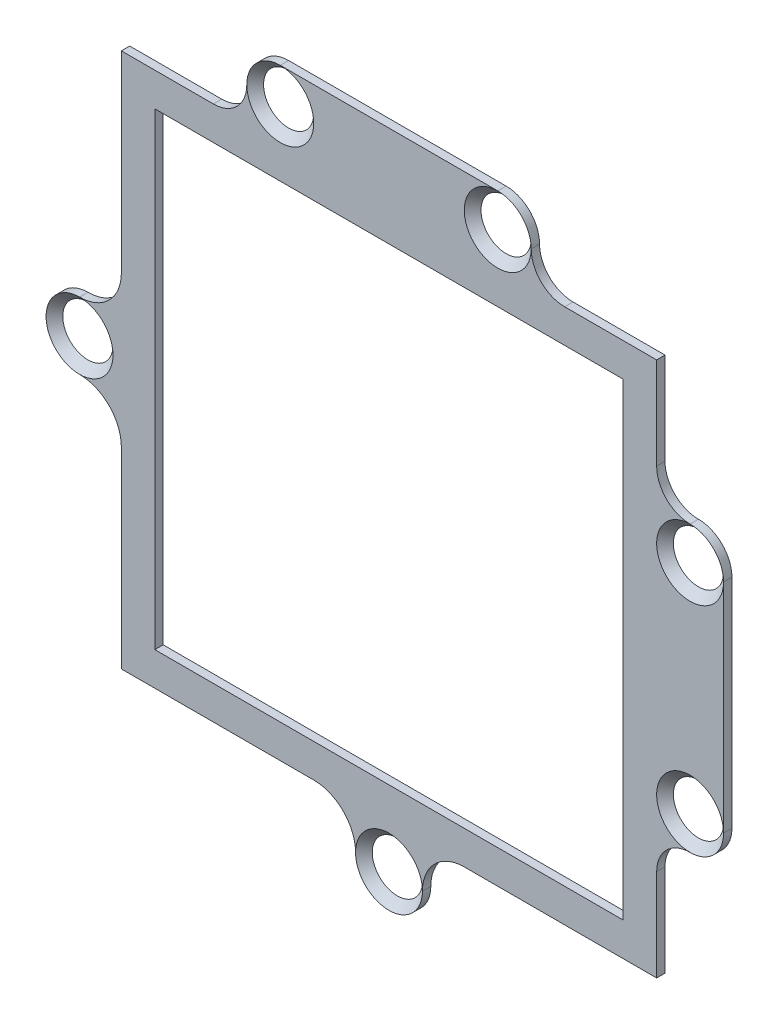
ISO-10303-21;
HEADER;
FILE_DESCRIPTION(('STEP AP214'),'2;1');
FILE_NAME('part.step','',(''),(''),'','','');
FILE_SCHEMA(('AUTOMOTIVE_DESIGN { 1 0 10303 214 1 1 1 1 }'));
ENDSEC;
DATA;
#1=APPLICATION_CONTEXT('core data for automotive mechanical design processes');
#2=APPLICATION_PROTOCOL_DEFINITION('international standard','automotive_design',2000,#1);
#3=PRODUCT_CONTEXT('',#1,'mechanical');
#4=PRODUCT('Part','Part','',(#3));
#5=PRODUCT_RELATED_PRODUCT_CATEGORY('part','',(#4));
#6=PRODUCT_DEFINITION_FORMATION('','',#4);
#7=PRODUCT_DEFINITION_CONTEXT('part definition',#1,'design');
#8=PRODUCT_DEFINITION('design','',#6,#7);
#9=PRODUCT_DEFINITION_SHAPE('','',#8);
#10=(LENGTH_UNIT() NAMED_UNIT(*) SI_UNIT(.MILLI.,.METRE.));
#11=(NAMED_UNIT(*) PLANE_ANGLE_UNIT() SI_UNIT($,.RADIAN.));
#12=(NAMED_UNIT(*) SI_UNIT($,.STERADIAN.) SOLID_ANGLE_UNIT());
#13=UNCERTAINTY_MEASURE_WITH_UNIT(LENGTH_MEASURE(1.E-05),#10,'distance_accuracy_value','');
#14=(GEOMETRIC_REPRESENTATION_CONTEXT(3) GLOBAL_UNCERTAINTY_ASSIGNED_CONTEXT((#13)) GLOBAL_UNIT_ASSIGNED_CONTEXT((#10,
#11,#12)) REPRESENTATION_CONTEXT('',''));
#15=CARTESIAN_POINT('',(0.,0.,0.));
#16=DIRECTION('',(0.,0.,1.));
#17=DIRECTION('',(1.,0.,0.));
#18=AXIS2_PLACEMENT_3D('',#15,#16,#17);
#19=CARTESIAN_POINT('',(36.0000000000001,-21.0000000000002,1.));
#20=DIRECTION('',(0.,0.,1.));
#21=DIRECTION('',(1.,0.,0.));
#22=AXIS2_PLACEMENT_3D('',#19,#20,#21);
#23=PLANE('',#22);
#24=CARTESIAN_POINT('',(21.0000000000002,36.0000000000001,1.));
#25=DIRECTION('',(0.,0.,-1.));
#26=DIRECTION('',(1.,0.,0.));
#27=AXIS2_PLACEMENT_3D('',#24,#25,#26);
#28=CIRCLE('',#27,4.00000000000011);
#29=CARTESIAN_POINT('',(21.0000000000002,32.,1.));
#30=VERTEX_POINT('',#29);
#31=CARTESIAN_POINT('',(17.0000000000001,36.0000000000001,1.));
#32=VERTEX_POINT('',#31);
#33=EDGE_CURVE('E300',#30,#32,#28,.T.);
#34=ORIENTED_EDGE('',*,*,#33,.T.);
#35=CARTESIAN_POINT('',(13.0000000000001,36.0000000000001,1.));
#36=DIRECTION('',(0.,0.,1.));
#37=DIRECTION('',(1.,0.,0.));
#38=AXIS2_PLACEMENT_3D('',#35,#36,#37);
#39=CIRCLE('',#38,4.00000000000001);
#40=CARTESIAN_POINT('',(13.0000000000001,40.0000000000001,1.));
#41=VERTEX_POINT('',#40);
#42=EDGE_CURVE('E11',#32,#41,#39,.F.);
#43=ORIENTED_EDGE('',*,*,#42,.T.);
#44=DIRECTION('',(-1.,0.,0.));
#45=VECTOR('',#44,1.);
#46=CARTESIAN_POINT('',(13.0000000000001,40.0000000000001,1.));
#47=LINE('',#46,#45);
#48=CARTESIAN_POINT('',(-13.0000000000001,40.0000000000001,1.));
#49=VERTEX_POINT('',#48);
#50=EDGE_CURVE('E306',#41,#49,#47,.T.);
#51=ORIENTED_EDGE('',*,*,#50,.T.);
#52=CARTESIAN_POINT('',(-13.0000000000001,36.0000000000001,1.));
#53=DIRECTION('',(0.,0.,1.));
#54=DIRECTION('',(1.,0.,0.));
#55=AXIS2_PLACEMENT_3D('',#52,#53,#54);
#56=CIRCLE('',#55,4.00000000000001);
#57=CARTESIAN_POINT('',(-17.0000000000001,36.0000000000001,1.));
#58=VERTEX_POINT('',#57);
#59=EDGE_CURVE('E51',#49,#58,#56,.F.);
#60=ORIENTED_EDGE('',*,*,#59,.T.);
#61=CARTESIAN_POINT('',(-21.0000000000003,36.0000000000001,1.));
#62=DIRECTION('',(0.,0.,-1.));
#63=DIRECTION('',(1.,0.,0.));
#64=AXIS2_PLACEMENT_3D('',#61,#62,#63);
#65=CIRCLE('',#64,4.00000000000012);
#66=CARTESIAN_POINT('',(-21.0000000000003,32.,1.));
#67=VERTEX_POINT('',#66);
#68=EDGE_CURVE('E314',#58,#67,#65,.T.);
#69=ORIENTED_EDGE('',*,*,#68,.T.);
#70=DIRECTION('',(-1.,0.,0.));
#71=VECTOR('',#70,1.);
#72=CARTESIAN_POINT('',(-21.0000000000003,32.,1.));
#73=LINE('',#72,#71);
#74=CARTESIAN_POINT('',(-32.,32.,1.));
#75=VERTEX_POINT('',#74);
#76=EDGE_CURVE('E317',#67,#75,#73,.T.);
#77=ORIENTED_EDGE('',*,*,#76,.T.);
#78=DIRECTION('',(0.,-1.,0.));
#79=VECTOR('',#78,1.);
#80=CARTESIAN_POINT('',(-32.,32.,1.));
#81=LINE('',#80,#79);
#82=CARTESIAN_POINT('',(-32.,9.00000000000001,1.));
#83=VERTEX_POINT('',#82);
#84=EDGE_CURVE('E320',#75,#83,#81,.T.);
#85=ORIENTED_EDGE('',*,*,#84,.T.);
#86=CARTESIAN_POINT('',(-37.,9.00000000000001,1.));
#87=DIRECTION('',(0.,0.,-1.));
#88=DIRECTION('',(1.,0.,0.));
#89=AXIS2_PLACEMENT_3D('',#86,#87,#88);
#90=CIRCLE('',#89,5.);
#91=CARTESIAN_POINT('',(-37.,4.,1.));
#92=VERTEX_POINT('',#91);
#93=EDGE_CURVE('E323',#83,#92,#90,.T.);
#94=ORIENTED_EDGE('',*,*,#93,.T.);
#95=CARTESIAN_POINT('',(-37.,0.,1.));
#96=DIRECTION('',(0.,0.,1.));
#97=DIRECTION('',(1.,0.,0.));
#98=AXIS2_PLACEMENT_3D('',#95,#96,#97);
#99=CIRCLE('',#98,4.00000000000002);
#100=CARTESIAN_POINT('',(-37.,-4.,1.));
#101=VERTEX_POINT('',#100);
#102=EDGE_CURVE('E558',#92,#101,#99,.F.);
#103=ORIENTED_EDGE('',*,*,#102,.T.);
#104=CARTESIAN_POINT('',(-37.,-9.00000000000001,1.));
#105=DIRECTION('',(0.,0.,-1.));
#106=DIRECTION('',(1.,0.,0.));
#107=AXIS2_PLACEMENT_3D('',#104,#105,#106);
#108=CIRCLE('',#107,5.);
#109=CARTESIAN_POINT('',(-32.,-9.00000000000001,1.));
#110=VERTEX_POINT('',#109);
#111=EDGE_CURVE('E331',#101,#110,#108,.T.);
#112=ORIENTED_EDGE('',*,*,#111,.T.);
#113=DIRECTION('',(0.,-1.,0.));
#114=VECTOR('',#113,1.);
#115=CARTESIAN_POINT('',(-32.,-9.00000000000001,1.));
#116=LINE('',#115,#114);
#117=CARTESIAN_POINT('',(-32.,-32.,1.));
#118=VERTEX_POINT('',#117);
#119=EDGE_CURVE('E334',#110,#118,#116,.T.);
#120=ORIENTED_EDGE('',*,*,#119,.T.);
#121=DIRECTION('',(1.,0.,0.));
#122=VECTOR('',#121,1.);
#123=CARTESIAN_POINT('',(-32.,-32.,1.));
#124=LINE('',#123,#122);
#125=CARTESIAN_POINT('',(-9.,-32.,1.));
#126=VERTEX_POINT('',#125);
#127=EDGE_CURVE('E337',#118,#126,#124,.T.);
#128=ORIENTED_EDGE('',*,*,#127,.T.);
#129=CARTESIAN_POINT('',(-9.,-37.,1.));
#130=DIRECTION('',(0.,0.,-1.));
#131=DIRECTION('',(1.,0.,0.));
#132=AXIS2_PLACEMENT_3D('',#129,#130,#131);
#133=CIRCLE('',#132,5.);
#134=CARTESIAN_POINT('',(-3.99999999999999,-37.,1.));
#135=VERTEX_POINT('',#134);
#136=EDGE_CURVE('E340',#126,#135,#133,.T.);
#137=ORIENTED_EDGE('',*,*,#136,.T.);
#138=CARTESIAN_POINT('',(0.,-37.,1.));
#139=DIRECTION('',(0.,0.,1.));
#140=DIRECTION('',(1.,0.,0.));
#141=AXIS2_PLACEMENT_3D('',#138,#139,#140);
#142=CIRCLE('',#141,4.00000000000002);
#143=CARTESIAN_POINT('',(4.00000000000001,-37.,1.));
#144=VERTEX_POINT('',#143);
#145=EDGE_CURVE('E552',#135,#144,#142,.F.);
#146=ORIENTED_EDGE('',*,*,#145,.T.);
#147=CARTESIAN_POINT('',(9.00000000000001,-37.,1.));
#148=DIRECTION('',(0.,0.,-1.));
#149=DIRECTION('',(1.,0.,0.));
#150=AXIS2_PLACEMENT_3D('',#147,#148,#149);
#151=CIRCLE('',#150,5.);
#152=CARTESIAN_POINT('',(9.00000000000001,-32.,1.));
#153=VERTEX_POINT('',#152);
#154=EDGE_CURVE('E348',#144,#153,#151,.T.);
#155=ORIENTED_EDGE('',*,*,#154,.T.);
#156=DIRECTION('',(1.,0.,0.));
#157=VECTOR('',#156,1.);
#158=CARTESIAN_POINT('',(9.00000000000001,-32.,1.));
#159=LINE('',#158,#157);
#160=CARTESIAN_POINT('',(32.,-32.,1.));
#161=VERTEX_POINT('',#160);
#162=EDGE_CURVE('E351',#153,#161,#159,.T.);
#163=ORIENTED_EDGE('',*,*,#162,.T.);
#164=DIRECTION('',(0.,1.,0.));
#165=VECTOR('',#164,1.);
#166=CARTESIAN_POINT('',(32.,-32.,1.));
#167=LINE('',#166,#165);
#168=CARTESIAN_POINT('',(32.,-21.0000000000002,1.));
#169=VERTEX_POINT('',#168);
#170=EDGE_CURVE('E354',#161,#169,#167,.T.);
#171=ORIENTED_EDGE('',*,*,#170,.T.);
#172=CARTESIAN_POINT('',(36.0000000000001,-21.0000000000002,1.));
#173=DIRECTION('',(0.,0.,-1.));
#174=DIRECTION('',(1.,0.,0.));
#175=AXIS2_PLACEMENT_3D('',#172,#173,#174);
#176=CIRCLE('',#175,4.00000000000012);
#177=CARTESIAN_POINT('',(36.0000000000001,-17.0000000000001,1.));
#178=VERTEX_POINT('',#177);
#179=EDGE_CURVE('E276',#169,#178,#176,.T.);
#180=ORIENTED_EDGE('',*,*,#179,.T.);
#181=CARTESIAN_POINT('',(36.0000000000001,-13.0000000000001,1.));
#182=DIRECTION('',(0.,0.,1.));
#183=DIRECTION('',(1.,0.,0.));
#184=AXIS2_PLACEMENT_3D('',#181,#182,#183);
#185=CIRCLE('',#184,4.00000000000002);
#186=CARTESIAN_POINT('',(40.0000000000001,-13.0000000000001,1.));
#187=VERTEX_POINT('',#186);
#188=EDGE_CURVE('E555',#178,#187,#185,.F.);
#189=ORIENTED_EDGE('',*,*,#188,.T.);
#190=DIRECTION('',(0.,1.,0.));
#191=VECTOR('',#190,1.);
#192=CARTESIAN_POINT('',(40.0000000000001,-13.0000000000001,1.));
#193=LINE('',#192,#191);
#194=CARTESIAN_POINT('',(40.0000000000001,13.0000000000001,1.));
#195=VERTEX_POINT('',#194);
#196=EDGE_CURVE('E285',#187,#195,#193,.T.);
#197=ORIENTED_EDGE('',*,*,#196,.T.);
#198=CARTESIAN_POINT('',(36.0000000000001,13.0000000000001,1.));
#199=DIRECTION('',(0.,0.,1.));
#200=DIRECTION('',(1.,0.,0.));
#201=AXIS2_PLACEMENT_3D('',#198,#199,#200);
#202=CIRCLE('',#201,4.00000000000002);
#203=CARTESIAN_POINT('',(36.0000000000001,17.0000000000001,1.));
#204=VERTEX_POINT('',#203);
#205=EDGE_CURVE('E548',#195,#204,#202,.F.);
#206=ORIENTED_EDGE('',*,*,#205,.T.);
#207=CARTESIAN_POINT('',(36.0000000000001,21.0000000000003,1.));
#208=DIRECTION('',(0.,0.,-1.));
#209=DIRECTION('',(1.,0.,0.));
#210=AXIS2_PLACEMENT_3D('',#207,#208,#209);
#211=CIRCLE('',#210,4.00000000000011);
#212=CARTESIAN_POINT('',(32.,21.0000000000003,1.));
#213=VERTEX_POINT('',#212);
#214=EDGE_CURVE('E291',#204,#213,#211,.T.);
#215=ORIENTED_EDGE('',*,*,#214,.T.);
#216=DIRECTION('',(0.,1.,0.));
#217=VECTOR('',#216,1.);
#218=CARTESIAN_POINT('',(32.,21.0000000000003,1.));
#219=LINE('',#218,#217);
#220=CARTESIAN_POINT('',(32.,32.,1.));
#221=VERTEX_POINT('',#220);
#222=EDGE_CURVE('E294',#213,#221,#219,.T.);
#223=ORIENTED_EDGE('',*,*,#222,.T.);
#224=DIRECTION('',(-1.,0.,0.));
#225=VECTOR('',#224,1.);
#226=CARTESIAN_POINT('',(32.,32.,1.));
#227=LINE('',#226,#225);
#228=EDGE_CURVE('E297',#221,#30,#227,.T.);
#229=ORIENTED_EDGE('',*,*,#228,.T.);
#230=EDGE_LOOP('',(#34,#43,#51,#60,#69,#77,#85,#94,#103,#112,#120,#128,#137,#146,#155,#163,#171,
#180,#189,#197,#206,#215,#223,#229));
#231=FACE_BOUND('',#230,.T.);
#232=DIRECTION('',(-1.,0.,0.));
#233=VECTOR('',#232,1.);
#234=CARTESIAN_POINT('',(-28.,28.,1.));
#235=LINE('',#234,#233);
#236=CARTESIAN_POINT('',(28.,28.,1.));
#237=VERTEX_POINT('',#236);
#238=CARTESIAN_POINT('',(-28.,28.,1.));
#239=VERTEX_POINT('',#238);
#240=EDGE_CURVE('E237',#237,#239,#235,.T.);
#241=ORIENTED_EDGE('',*,*,#240,.F.);
#242=DIRECTION('',(0.,1.,0.));
#243=VECTOR('',#242,1.);
#244=CARTESIAN_POINT('',(28.,28.,1.));
#245=LINE('',#244,#243);
#246=CARTESIAN_POINT('',(28.,-28.,1.));
#247=VERTEX_POINT('',#246);
#248=EDGE_CURVE('E228',#247,#237,#245,.T.);
#249=ORIENTED_EDGE('',*,*,#248,.F.);
#250=DIRECTION('',(1.,0.,0.));
#251=VECTOR('',#250,1.);
#252=CARTESIAN_POINT('',(28.,-28.,1.));
#253=LINE('',#252,#251);
#254=CARTESIAN_POINT('',(-28.,-28.,1.));
#255=VERTEX_POINT('',#254);
#256=EDGE_CURVE('E254',#255,#247,#253,.T.);
#257=ORIENTED_EDGE('',*,*,#256,.F.);
#258=DIRECTION('',(0.,-1.,0.));
#259=VECTOR('',#258,1.);
#260=CARTESIAN_POINT('',(-28.,-28.,1.));
#261=LINE('',#260,#259);
#262=EDGE_CURVE('E250',#239,#255,#261,.T.);
#263=ORIENTED_EDGE('',*,*,#262,.F.);
#264=EDGE_LOOP('',(#241,#249,#257,#263));
#265=FACE_BOUND('',#264,.T.);
#266=ADVANCED_FACE('F41',(#231,#265),#23,.T.);
#267=CARTESIAN_POINT('',(36.0000000000001,-21.0000000000002,0.));
#268=DIRECTION('',(0.,0.,1.));
#269=DIRECTION('',(1.,0.,0.));
#270=AXIS2_PLACEMENT_3D('',#267,#268,#269);
#271=PLANE('',#270);
#272=CARTESIAN_POINT('',(13.0000000000001,36.0000000000001,0.));
#273=DIRECTION('',(0.,0.,1.));
#274=DIRECTION('',(1.,0.,0.));
#275=AXIS2_PLACEMENT_3D('',#272,#273,#274);
#276=CIRCLE('',#275,3.00000000000002);
#277=CARTESIAN_POINT('',(16.0000000000001,36.0000000000001,0.));
#278=VERTEX_POINT('',#277);
#279=EDGE_CURVE('E544',#278,#278,#276,.T.);
#280=ORIENTED_EDGE('',*,*,#279,.T.);
#281=EDGE_LOOP('',(#280));
#282=FACE_BOUND('',#281,.T.);
#283=CARTESIAN_POINT('',(-13.0000000000001,36.0000000000001,0.));
#284=DIRECTION('',(0.,0.,1.));
#285=DIRECTION('',(1.,0.,0.));
#286=AXIS2_PLACEMENT_3D('',#283,#284,#285);
#287=CIRCLE('',#286,3.00000000000002);
#288=CARTESIAN_POINT('',(-10.0000000000001,36.0000000000001,0.));
#289=VERTEX_POINT('',#288);
#290=EDGE_CURVE('E540',#289,#289,#287,.T.);
#291=ORIENTED_EDGE('',*,*,#290,.T.);
#292=EDGE_LOOP('',(#291));
#293=FACE_BOUND('',#292,.T.);
#294=CARTESIAN_POINT('',(-37.,0.,0.));
#295=DIRECTION('',(0.,0.,1.));
#296=DIRECTION('',(1.,0.,0.));
#297=AXIS2_PLACEMENT_3D('',#294,#295,#296);
#298=CIRCLE('',#297,3.00000000000003);
#299=CARTESIAN_POINT('',(-34.,0.,0.));
#300=VERTEX_POINT('',#299);
#301=EDGE_CURVE('E536',#300,#300,#298,.T.);
#302=ORIENTED_EDGE('',*,*,#301,.T.);
#303=EDGE_LOOP('',(#302));
#304=FACE_BOUND('',#303,.T.);
#305=CARTESIAN_POINT('',(36.0000000000001,-13.0000000000001,0.));
#306=DIRECTION('',(0.,0.,1.));
#307=DIRECTION('',(1.,0.,0.));
#308=AXIS2_PLACEMENT_3D('',#305,#306,#307);
#309=CIRCLE('',#308,3.00000000000003);
#310=CARTESIAN_POINT('',(39.0000000000002,-13.0000000000001,0.));
#311=VERTEX_POINT('',#310);
#312=EDGE_CURVE('E532',#311,#311,#309,.T.);
#313=ORIENTED_EDGE('',*,*,#312,.T.);
#314=EDGE_LOOP('',(#313));
#315=FACE_BOUND('',#314,.T.);
#316=CARTESIAN_POINT('',(0.,-37.,0.));
#317=DIRECTION('',(0.,0.,1.));
#318=DIRECTION('',(1.,0.,0.));
#319=AXIS2_PLACEMENT_3D('',#316,#317,#318);
#320=CIRCLE('',#319,3.00000000000003);
#321=CARTESIAN_POINT('',(3.00000000000004,-37.,0.));
#322=VERTEX_POINT('',#321);
#323=EDGE_CURVE('E528',#322,#322,#320,.T.);
#324=ORIENTED_EDGE('',*,*,#323,.T.);
#325=EDGE_LOOP('',(#324));
#326=FACE_BOUND('',#325,.T.);
#327=CARTESIAN_POINT('',(36.0000000000001,13.0000000000001,0.));
#328=DIRECTION('',(0.,0.,1.));
#329=DIRECTION('',(1.,0.,0.));
#330=AXIS2_PLACEMENT_3D('',#327,#328,#329);
#331=CIRCLE('',#330,3.00000000000003);
#332=CARTESIAN_POINT('',(39.0000000000001,13.0000000000001,0.));
#333=VERTEX_POINT('',#332);
#334=EDGE_CURVE('E524',#333,#333,#331,.T.);
#335=ORIENTED_EDGE('',*,*,#334,.T.);
#336=EDGE_LOOP('',(#335));
#337=FACE_BOUND('',#336,.T.);
#338=CARTESIAN_POINT('',(36.0000000000001,-21.0000000000002,0.));
#339=DIRECTION('',(0.,0.,-1.));
#340=DIRECTION('',(1.,0.,0.));
#341=AXIS2_PLACEMENT_3D('',#338,#339,#340);
#342=CIRCLE('',#341,4.00000000000012);
#343=CARTESIAN_POINT('',(32.,-21.0000000000002,0.));
#344=VERTEX_POINT('',#343);
#345=CARTESIAN_POINT('',(36.0000000000001,-17.0000000000001,0.));
#346=VERTEX_POINT('',#345);
#347=EDGE_CURVE('E246',#344,#346,#342,.T.);
#348=ORIENTED_EDGE('',*,*,#347,.F.);
#349=DIRECTION('',(0.,1.,0.));
#350=VECTOR('',#349,1.);
#351=CARTESIAN_POINT('',(32.,-32.,0.));
#352=LINE('',#351,#350);
#353=CARTESIAN_POINT('',(32.,-32.,0.));
#354=VERTEX_POINT('',#353);
#355=EDGE_CURVE('E281',#354,#344,#352,.T.);
#356=ORIENTED_EDGE('',*,*,#355,.F.);
#357=DIRECTION('',(1.,0.,0.));
#358=VECTOR('',#357,1.);
#359=CARTESIAN_POINT('',(9.00000000000001,-32.,0.));
#360=LINE('',#359,#358);
#361=CARTESIAN_POINT('',(9.00000000000001,-32.,0.));
#362=VERTEX_POINT('',#361);
#363=EDGE_CURVE('E424',#362,#354,#360,.T.);
#364=ORIENTED_EDGE('',*,*,#363,.F.);
#365=CARTESIAN_POINT('',(9.00000000000001,-37.,0.));
#366=DIRECTION('',(0.,0.,-1.));
#367=DIRECTION('',(1.,0.,0.));
#368=AXIS2_PLACEMENT_3D('',#365,#366,#367);
#369=CIRCLE('',#368,5.);
#370=CARTESIAN_POINT('',(4.00000000000001,-37.,0.));
#371=VERTEX_POINT('',#370);
#372=EDGE_CURVE('E421',#371,#362,#369,.T.);
#373=ORIENTED_EDGE('',*,*,#372,.F.);
#374=CARTESIAN_POINT('',(0.,-37.,0.));
#375=DIRECTION('',(0.,0.,1.));
#376=DIRECTION('',(1.,0.,0.));
#377=AXIS2_PLACEMENT_3D('',#374,#375,#376);
#378=CIRCLE('',#377,4.);
#379=CARTESIAN_POINT('',(-3.99999999999999,-37.,0.));
#380=VERTEX_POINT('',#379);
#381=EDGE_CURVE('E418',#380,#371,#378,.T.);
#382=ORIENTED_EDGE('',*,*,#381,.F.);
#383=CARTESIAN_POINT('',(-9.,-37.,0.));
#384=DIRECTION('',(0.,0.,-1.));
#385=DIRECTION('',(1.,0.,0.));
#386=AXIS2_PLACEMENT_3D('',#383,#384,#385);
#387=CIRCLE('',#386,5.);
#388=CARTESIAN_POINT('',(-9.,-32.,0.));
#389=VERTEX_POINT('',#388);
#390=EDGE_CURVE('E415',#389,#380,#387,.T.);
#391=ORIENTED_EDGE('',*,*,#390,.F.);
#392=DIRECTION('',(1.,0.,0.));
#393=VECTOR('',#392,1.);
#394=CARTESIAN_POINT('',(-32.,-32.,0.));
#395=LINE('',#394,#393);
#396=CARTESIAN_POINT('',(-32.,-32.,0.));
#397=VERTEX_POINT('',#396);
#398=EDGE_CURVE('E412',#397,#389,#395,.T.);
#399=ORIENTED_EDGE('',*,*,#398,.F.);
#400=DIRECTION('',(0.,-1.,0.));
#401=VECTOR('',#400,1.);
#402=CARTESIAN_POINT('',(-32.,-9.00000000000001,0.));
#403=LINE('',#402,#401);
#404=CARTESIAN_POINT('',(-32.,-9.00000000000001,0.));
#405=VERTEX_POINT('',#404);
#406=EDGE_CURVE('E409',#405,#397,#403,.T.);
#407=ORIENTED_EDGE('',*,*,#406,.F.);
#408=CARTESIAN_POINT('',(-37.,-9.00000000000001,0.));
#409=DIRECTION('',(0.,0.,-1.));
#410=DIRECTION('',(1.,0.,0.));
#411=AXIS2_PLACEMENT_3D('',#408,#409,#410);
#412=CIRCLE('',#411,5.);
#413=CARTESIAN_POINT('',(-37.,-4.,0.));
#414=VERTEX_POINT('',#413);
#415=EDGE_CURVE('E406',#414,#405,#412,.T.);
#416=ORIENTED_EDGE('',*,*,#415,.F.);
#417=CARTESIAN_POINT('',(-37.,0.,0.));
#418=DIRECTION('',(0.,0.,1.));
#419=DIRECTION('',(1.,0.,0.));
#420=AXIS2_PLACEMENT_3D('',#417,#418,#419);
#421=CIRCLE('',#420,4.);
#422=CARTESIAN_POINT('',(-37.,4.,0.));
#423=VERTEX_POINT('',#422);
#424=EDGE_CURVE('E403',#423,#414,#421,.T.);
#425=ORIENTED_EDGE('',*,*,#424,.F.);
#426=CARTESIAN_POINT('',(-37.,9.00000000000001,0.));
#427=DIRECTION('',(0.,0.,-1.));
#428=DIRECTION('',(1.,0.,0.));
#429=AXIS2_PLACEMENT_3D('',#426,#427,#428);
#430=CIRCLE('',#429,5.);
#431=CARTESIAN_POINT('',(-32.,9.00000000000001,0.));
#432=VERTEX_POINT('',#431);
#433=EDGE_CURVE('E400',#432,#423,#430,.T.);
#434=ORIENTED_EDGE('',*,*,#433,.F.);
#435=DIRECTION('',(0.,-1.,0.));
#436=VECTOR('',#435,1.);
#437=CARTESIAN_POINT('',(-32.,32.,0.));
#438=LINE('',#437,#436);
#439=CARTESIAN_POINT('',(-32.,32.,0.));
#440=VERTEX_POINT('',#439);
#441=EDGE_CURVE('E397',#440,#432,#438,.T.);
#442=ORIENTED_EDGE('',*,*,#441,.F.);
#443=DIRECTION('',(-1.,0.,0.));
#444=VECTOR('',#443,1.);
#445=CARTESIAN_POINT('',(-21.0000000000003,32.,0.));
#446=LINE('',#445,#444);
#447=CARTESIAN_POINT('',(-21.0000000000003,32.,0.));
#448=VERTEX_POINT('',#447);
#449=EDGE_CURVE('E394',#448,#440,#446,.T.);
#450=ORIENTED_EDGE('',*,*,#449,.F.);
#451=CARTESIAN_POINT('',(-21.0000000000003,36.0000000000001,0.));
#452=DIRECTION('',(0.,0.,-1.));
#453=DIRECTION('',(1.,0.,0.));
#454=AXIS2_PLACEMENT_3D('',#451,#452,#453);
#455=CIRCLE('',#454,4.00000000000012);
#456=CARTESIAN_POINT('',(-17.0000000000001,36.0000000000001,0.));
#457=VERTEX_POINT('',#456);
#458=EDGE_CURVE('E391',#457,#448,#455,.T.);
#459=ORIENTED_EDGE('',*,*,#458,.F.);
#460=CARTESIAN_POINT('',(-13.0000000000001,36.0000000000001,0.));
#461=DIRECTION('',(0.,0.,1.));
#462=DIRECTION('',(1.,0.,0.));
#463=AXIS2_PLACEMENT_3D('',#460,#461,#462);
#464=CIRCLE('',#463,3.99999999999997);
#465=CARTESIAN_POINT('',(-13.0000000000001,40.0000000000001,0.));
#466=VERTEX_POINT('',#465);
#467=EDGE_CURVE('E388',#466,#457,#464,.T.);
#468=ORIENTED_EDGE('',*,*,#467,.F.);
#469=DIRECTION('',(-1.,0.,0.));
#470=VECTOR('',#469,1.);
#471=CARTESIAN_POINT('',(13.0000000000001,40.0000000000001,0.));
#472=LINE('',#471,#470);
#473=CARTESIAN_POINT('',(13.0000000000001,40.0000000000001,0.));
#474=VERTEX_POINT('',#473);
#475=EDGE_CURVE('E385',#474,#466,#472,.T.);
#476=ORIENTED_EDGE('',*,*,#475,.F.);
#477=CARTESIAN_POINT('',(13.0000000000001,36.0000000000001,0.));
#478=DIRECTION('',(0.,0.,1.));
#479=DIRECTION('',(1.,0.,0.));
#480=AXIS2_PLACEMENT_3D('',#477,#478,#479);
#481=CIRCLE('',#480,4.);
#482=CARTESIAN_POINT('',(17.0000000000001,36.0000000000001,0.));
#483=VERTEX_POINT('',#482);
#484=EDGE_CURVE('E382',#483,#474,#481,.T.);
#485=ORIENTED_EDGE('',*,*,#484,.F.);
#486=CARTESIAN_POINT('',(21.0000000000002,36.0000000000001,0.));
#487=DIRECTION('',(0.,0.,-1.));
#488=DIRECTION('',(1.,0.,0.));
#489=AXIS2_PLACEMENT_3D('',#486,#487,#488);
#490=CIRCLE('',#489,4.00000000000011);
#491=CARTESIAN_POINT('',(21.0000000000002,32.,0.));
#492=VERTEX_POINT('',#491);
#493=EDGE_CURVE('E379',#492,#483,#490,.T.);
#494=ORIENTED_EDGE('',*,*,#493,.F.);
#495=DIRECTION('',(-1.,0.,0.));
#496=VECTOR('',#495,1.);
#497=CARTESIAN_POINT('',(32.,32.,0.));
#498=LINE('',#497,#496);
#499=CARTESIAN_POINT('',(32.,32.,0.));
#500=VERTEX_POINT('',#499);
#501=EDGE_CURVE('E376',#500,#492,#498,.T.);
#502=ORIENTED_EDGE('',*,*,#501,.F.);
#503=DIRECTION('',(0.,1.,0.));
#504=VECTOR('',#503,1.);
#505=CARTESIAN_POINT('',(32.,21.0000000000003,0.));
#506=LINE('',#505,#504);
#507=CARTESIAN_POINT('',(32.,21.0000000000003,0.));
#508=VERTEX_POINT('',#507);
#509=EDGE_CURVE('E373',#508,#500,#506,.T.);
#510=ORIENTED_EDGE('',*,*,#509,.F.);
#511=CARTESIAN_POINT('',(36.0000000000001,21.0000000000003,0.));
#512=DIRECTION('',(0.,0.,-1.));
#513=DIRECTION('',(1.,0.,0.));
#514=AXIS2_PLACEMENT_3D('',#511,#512,#513);
#515=CIRCLE('',#514,4.00000000000011);
#516=CARTESIAN_POINT('',(36.0000000000001,17.0000000000001,0.));
#517=VERTEX_POINT('',#516);
#518=EDGE_CURVE('E370',#517,#508,#515,.T.);
#519=ORIENTED_EDGE('',*,*,#518,.F.);
#520=CARTESIAN_POINT('',(36.0000000000001,13.0000000000001,0.));
#521=DIRECTION('',(0.,0.,1.));
#522=DIRECTION('',(1.,0.,0.));
#523=AXIS2_PLACEMENT_3D('',#520,#521,#522);
#524=CIRCLE('',#523,3.99999999999998);
#525=CARTESIAN_POINT('',(40.0000000000001,13.0000000000001,0.));
#526=VERTEX_POINT('',#525);
#527=EDGE_CURVE('E367',#526,#517,#524,.T.);
#528=ORIENTED_EDGE('',*,*,#527,.F.);
#529=DIRECTION('',(0.,1.,0.));
#530=VECTOR('',#529,1.);
#531=CARTESIAN_POINT('',(40.0000000000001,-13.0000000000001,0.));
#532=LINE('',#531,#530);
#533=CARTESIAN_POINT('',(40.0000000000001,-13.0000000000001,0.));
#534=VERTEX_POINT('',#533);
#535=EDGE_CURVE('E364',#534,#526,#532,.T.);
#536=ORIENTED_EDGE('',*,*,#535,.F.);
#537=CARTESIAN_POINT('',(36.0000000000001,-13.0000000000001,0.));
#538=DIRECTION('',(0.,0.,1.));
#539=DIRECTION('',(1.,0.,0.));
#540=AXIS2_PLACEMENT_3D('',#537,#538,#539);
#541=CIRCLE('',#540,3.99999999999997);
#542=EDGE_CURVE('E361',#346,#534,#541,.T.);
#543=ORIENTED_EDGE('',*,*,#542,.F.);
#544=EDGE_LOOP('',(#348,#356,#364,#373,#382,#391,#399,#407,#416,#425,#434,#442,#450,#459,#468,
#476,#485,#494,#502,#510,#519,#528,#536,#543));
#545=FACE_BOUND('',#544,.T.);
#546=DIRECTION('',(0.,1.,0.));
#547=VECTOR('',#546,1.);
#548=CARTESIAN_POINT('',(28.,28.,0.));
#549=LINE('',#548,#547);
#550=CARTESIAN_POINT('',(28.,-28.,0.));
#551=VERTEX_POINT('',#550);
#552=CARTESIAN_POINT('',(28.,28.,0.));
#553=VERTEX_POINT('',#552);
#554=EDGE_CURVE('E66',#551,#553,#549,.T.);
#555=ORIENTED_EDGE('',*,*,#554,.T.);
#556=DIRECTION('',(-1.,0.,0.));
#557=VECTOR('',#556,1.);
#558=CARTESIAN_POINT('',(-28.,28.,0.));
#559=LINE('',#558,#557);
#560=CARTESIAN_POINT('',(-28.,28.,0.));
#561=VERTEX_POINT('',#560);
#562=EDGE_CURVE('E244',#553,#561,#559,.T.);
#563=ORIENTED_EDGE('',*,*,#562,.T.);
#564=DIRECTION('',(0.,-1.,0.));
#565=VECTOR('',#564,1.);
#566=CARTESIAN_POINT('',(-28.,-28.,0.));
#567=LINE('',#566,#565);
#568=CARTESIAN_POINT('',(-28.,-28.,0.));
#569=VERTEX_POINT('',#568);
#570=EDGE_CURVE('E263',#561,#569,#567,.T.);
#571=ORIENTED_EDGE('',*,*,#570,.T.);
#572=DIRECTION('',(1.,0.,0.));
#573=VECTOR('',#572,1.);
#574=CARTESIAN_POINT('',(28.,-28.,0.));
#575=LINE('',#574,#573);
#576=EDGE_CURVE('E238',#569,#551,#575,.T.);
#577=ORIENTED_EDGE('',*,*,#576,.T.);
#578=EDGE_LOOP('',(#555,#563,#571,#577));
#579=FACE_BOUND('',#578,.T.);
#580=ADVANCED_FACE('F584',(#282,#293,#304,#315,#326,#337,#545,#579),#271,.F.);
#581=CARTESIAN_POINT('',(36.0000000000001,-21.0000000000002,1.));
#582=DIRECTION('',(0.,0.,-1.));
#583=DIRECTION('',(-1.,0.,0.));
#584=AXIS2_PLACEMENT_3D('',#581,#582,#583);
#585=CYLINDRICAL_SURFACE('',#584,4.00000000000012);
#586=ORIENTED_EDGE('',*,*,#347,.T.);
#587=DIRECTION('',(0.,0.,-1.));
#588=VECTOR('',#587,1.);
#589=CARTESIAN_POINT('',(36.0000000000001,-17.0000000000001,1.));
#590=LINE('',#589,#588);
#591=EDGE_CURVE('E520',#178,#346,#590,.T.);
#592=ORIENTED_EDGE('',*,*,#591,.F.);
#593=ORIENTED_EDGE('',*,*,#179,.F.);
#594=DIRECTION('',(0.,0.,-1.));
#595=VECTOR('',#594,1.);
#596=CARTESIAN_POINT('',(32.,-21.0000000000002,1.));
#597=LINE('',#596,#595);
#598=EDGE_CURVE('E357',#169,#344,#597,.T.);
#599=ORIENTED_EDGE('',*,*,#598,.T.);
#600=EDGE_LOOP('',(#586,#592,#593,#599));
#601=FACE_BOUND('',#600,.T.);
#602=ADVANCED_FACE('F587',(#601),#585,.F.);
#603=CARTESIAN_POINT('',(36.0000000000001,-13.0000000000001,1.));
#604=DIRECTION('',(0.,0.,-1.));
#605=DIRECTION('',(-1.,0.,0.));
#606=AXIS2_PLACEMENT_3D('',#603,#604,#605);
#607=CYLINDRICAL_SURFACE('',#606,3.99999999999997);
#608=ORIENTED_EDGE('',*,*,#542,.T.);
#609=DIRECTION('',(0.,0.,-1.));
#610=VECTOR('',#609,1.);
#611=CARTESIAN_POINT('',(40.0000000000001,-13.0000000000001,1.));
#612=LINE('',#611,#610);
#613=EDGE_CURVE('E516',#187,#534,#612,.T.);
#614=ORIENTED_EDGE('',*,*,#613,.F.);
#615=CARTESIAN_POINT('',(36.0000000000001,-13.0000000000001,1.));
#616=DIRECTION('',(0.,0.,1.));
#617=DIRECTION('',(1.,0.,0.));
#618=AXIS2_PLACEMENT_3D('',#615,#616,#617);
#619=CIRCLE('',#618,3.99999999999997);
#620=EDGE_CURVE('E280',#178,#187,#619,.T.);
#621=ORIENTED_EDGE('',*,*,#620,.F.);
#622=ORIENTED_EDGE('',*,*,#591,.T.);
#623=EDGE_LOOP('',(#608,#614,#621,#622));
#624=FACE_BOUND('',#623,.T.);
#625=ADVANCED_FACE('F704',(#624),#607,.T.);
#626=CARTESIAN_POINT('',(40.0000000000001,-13.0000000000001,1.));
#627=DIRECTION('',(-1.,0.,0.));
#628=DIRECTION('',(0.,-1.,0.));
#629=AXIS2_PLACEMENT_3D('',#626,#627,#628);
#630=PLANE('',#629);
#631=ORIENTED_EDGE('',*,*,#535,.T.);
#632=DIRECTION('',(0.,0.,-1.));
#633=VECTOR('',#632,1.);
#634=CARTESIAN_POINT('',(40.0000000000001,13.0000000000001,1.));
#635=LINE('',#634,#633);
#636=EDGE_CURVE('E512',#195,#526,#635,.T.);
#637=ORIENTED_EDGE('',*,*,#636,.F.);
#638=ORIENTED_EDGE('',*,*,#196,.F.);
#639=ORIENTED_EDGE('',*,*,#613,.T.);
#640=EDGE_LOOP('',(#631,#637,#638,#639));
#641=FACE_BOUND('',#640,.T.);
#642=ADVANCED_FACE('F700',(#641),#630,.F.);
#643=CARTESIAN_POINT('',(36.0000000000001,13.0000000000001,1.));
#644=DIRECTION('',(0.,0.,-1.));
#645=DIRECTION('',(-1.,0.,0.));
#646=AXIS2_PLACEMENT_3D('',#643,#644,#645);
#647=CYLINDRICAL_SURFACE('',#646,3.99999999999998);
#648=ORIENTED_EDGE('',*,*,#527,.T.);
#649=DIRECTION('',(0.,0.,-1.));
#650=VECTOR('',#649,1.);
#651=CARTESIAN_POINT('',(36.0000000000001,17.0000000000001,1.));
#652=LINE('',#651,#650);
#653=EDGE_CURVE('E508',#204,#517,#652,.T.);
#654=ORIENTED_EDGE('',*,*,#653,.F.);
#655=CARTESIAN_POINT('',(36.0000000000001,13.0000000000001,1.));
#656=DIRECTION('',(0.,0.,1.));
#657=DIRECTION('',(1.,0.,0.));
#658=AXIS2_PLACEMENT_3D('',#655,#656,#657);
#659=CIRCLE('',#658,3.99999999999998);
#660=EDGE_CURVE('E288',#195,#204,#659,.T.);
#661=ORIENTED_EDGE('',*,*,#660,.F.);
#662=ORIENTED_EDGE('',*,*,#636,.T.);
#663=EDGE_LOOP('',(#648,#654,#661,#662));
#664=FACE_BOUND('',#663,.T.);
#665=ADVANCED_FACE('F696',(#664),#647,.T.);
#666=CARTESIAN_POINT('',(36.0000000000001,21.0000000000003,1.));
#667=DIRECTION('',(0.,0.,-1.));
#668=DIRECTION('',(-1.,0.,0.));
#669=AXIS2_PLACEMENT_3D('',#666,#667,#668);
#670=CYLINDRICAL_SURFACE('',#669,4.00000000000011);
#671=ORIENTED_EDGE('',*,*,#518,.T.);
#672=DIRECTION('',(0.,0.,-1.));
#673=VECTOR('',#672,1.);
#674=CARTESIAN_POINT('',(32.,21.0000000000003,1.));
#675=LINE('',#674,#673);
#676=EDGE_CURVE('E504',#213,#508,#675,.T.);
#677=ORIENTED_EDGE('',*,*,#676,.F.);
#678=ORIENTED_EDGE('',*,*,#214,.F.);
#679=ORIENTED_EDGE('',*,*,#653,.T.);
#680=EDGE_LOOP('',(#671,#677,#678,#679));
#681=FACE_BOUND('',#680,.T.);
#682=ADVANCED_FACE('F692',(#681),#670,.F.);
#683=CARTESIAN_POINT('',(32.,21.0000000000003,1.));
#684=DIRECTION('',(-1.,0.,0.));
#685=DIRECTION('',(0.,-1.,0.));
#686=AXIS2_PLACEMENT_3D('',#683,#684,#685);
#687=PLANE('',#686);
#688=ORIENTED_EDGE('',*,*,#509,.T.);
#689=DIRECTION('',(0.,0.,-1.));
#690=VECTOR('',#689,1.);
#691=CARTESIAN_POINT('',(32.,32.,1.));
#692=LINE('',#691,#690);
#693=EDGE_CURVE('E500',#221,#500,#692,.T.);
#694=ORIENTED_EDGE('',*,*,#693,.F.);
#695=ORIENTED_EDGE('',*,*,#222,.F.);
#696=ORIENTED_EDGE('',*,*,#676,.T.);
#697=EDGE_LOOP('',(#688,#694,#695,#696));
#698=FACE_BOUND('',#697,.T.);
#699=ADVANCED_FACE('F688',(#698),#687,.F.);
#700=CARTESIAN_POINT('',(32.,32.,1.));
#701=DIRECTION('',(0.,-1.,0.));
#702=DIRECTION('',(0.,0.,-1.));
#703=AXIS2_PLACEMENT_3D('',#700,#701,#702);
#704=PLANE('',#703);
#705=ORIENTED_EDGE('',*,*,#501,.T.);
#706=DIRECTION('',(0.,0.,-1.));
#707=VECTOR('',#706,1.);
#708=CARTESIAN_POINT('',(21.0000000000002,32.,1.));
#709=LINE('',#708,#707);
#710=EDGE_CURVE('E496',#30,#492,#709,.T.);
#711=ORIENTED_EDGE('',*,*,#710,.F.);
#712=ORIENTED_EDGE('',*,*,#228,.F.);
#713=ORIENTED_EDGE('',*,*,#693,.T.);
#714=EDGE_LOOP('',(#705,#711,#712,#713));
#715=FACE_BOUND('',#714,.T.);
#716=ADVANCED_FACE('F684',(#715),#704,.F.);
#717=CARTESIAN_POINT('',(21.0000000000002,36.0000000000001,1.));
#718=DIRECTION('',(0.,0.,-1.));
#719=DIRECTION('',(-1.,0.,0.));
#720=AXIS2_PLACEMENT_3D('',#717,#718,#719);
#721=CYLINDRICAL_SURFACE('',#720,4.00000000000011);
#722=ORIENTED_EDGE('',*,*,#493,.T.);
#723=DIRECTION('',(0.,0.,-1.));
#724=VECTOR('',#723,1.);
#725=CARTESIAN_POINT('',(17.0000000000001,36.0000000000001,1.));
#726=LINE('',#725,#724);
#727=EDGE_CURVE('E492',#32,#483,#726,.T.);
#728=ORIENTED_EDGE('',*,*,#727,.F.);
#729=ORIENTED_EDGE('',*,*,#33,.F.);
#730=ORIENTED_EDGE('',*,*,#710,.T.);
#731=EDGE_LOOP('',(#722,#728,#729,#730));
#732=FACE_BOUND('',#731,.T.);
#733=ADVANCED_FACE('F680',(#732),#721,.F.);
#734=CARTESIAN_POINT('',(13.0000000000001,36.0000000000001,1.));
#735=DIRECTION('',(0.,0.,-1.));
#736=DIRECTION('',(-1.,0.,0.));
#737=AXIS2_PLACEMENT_3D('',#734,#735,#736);
#738=CYLINDRICAL_SURFACE('',#737,4.);
#739=ORIENTED_EDGE('',*,*,#484,.T.);
#740=DIRECTION('',(0.,0.,-1.));
#741=VECTOR('',#740,1.);
#742=CARTESIAN_POINT('',(13.0000000000001,40.0000000000001,1.));
#743=LINE('',#742,#741);
#744=EDGE_CURVE('E488',#41,#474,#743,.T.);
#745=ORIENTED_EDGE('',*,*,#744,.F.);
#746=CARTESIAN_POINT('',(13.0000000000001,36.0000000000001,1.));
#747=DIRECTION('',(0.,0.,1.));
#748=DIRECTION('',(1.,0.,0.));
#749=AXIS2_PLACEMENT_3D('',#746,#747,#748);
#750=CIRCLE('',#749,4.);
#751=EDGE_CURVE('E303',#32,#41,#750,.T.);
#752=ORIENTED_EDGE('',*,*,#751,.F.);
#753=ORIENTED_EDGE('',*,*,#727,.T.);
#754=EDGE_LOOP('',(#739,#745,#752,#753));
#755=FACE_BOUND('',#754,.T.);
#756=ADVANCED_FACE('F676',(#755),#738,.T.);
#757=CARTESIAN_POINT('',(13.0000000000001,40.0000000000001,1.));
#758=DIRECTION('',(0.,-1.,0.));
#759=DIRECTION('',(1.,0.,0.));
#760=AXIS2_PLACEMENT_3D('',#757,#758,#759);
#761=PLANE('',#760);
#762=ORIENTED_EDGE('',*,*,#475,.T.);
#763=DIRECTION('',(0.,0.,-1.));
#764=VECTOR('',#763,1.);
#765=CARTESIAN_POINT('',(-13.0000000000001,40.0000000000001,1.));
#766=LINE('',#765,#764);
#767=EDGE_CURVE('E484',#49,#466,#766,.T.);
#768=ORIENTED_EDGE('',*,*,#767,.F.);
#769=ORIENTED_EDGE('',*,*,#50,.F.);
#770=ORIENTED_EDGE('',*,*,#744,.T.);
#771=EDGE_LOOP('',(#762,#768,#769,#770));
#772=FACE_BOUND('',#771,.T.);
#773=ADVANCED_FACE('F673',(#772),#761,.F.);
#774=CARTESIAN_POINT('',(-13.0000000000001,36.0000000000001,1.));
#775=DIRECTION('',(0.,0.,-1.));
#776=DIRECTION('',(-1.,0.,0.));
#777=AXIS2_PLACEMENT_3D('',#774,#775,#776);
#778=CYLINDRICAL_SURFACE('',#777,3.99999999999997);
#779=ORIENTED_EDGE('',*,*,#467,.T.);
#780=DIRECTION('',(0.,0.,-1.));
#781=VECTOR('',#780,1.);
#782=CARTESIAN_POINT('',(-17.0000000000001,36.0000000000001,1.));
#783=LINE('',#782,#781);
#784=EDGE_CURVE('E480',#58,#457,#783,.T.);
#785=ORIENTED_EDGE('',*,*,#784,.F.);
#786=CARTESIAN_POINT('',(-13.0000000000001,36.0000000000001,1.));
#787=DIRECTION('',(0.,0.,1.));
#788=DIRECTION('',(1.,0.,0.));
#789=AXIS2_PLACEMENT_3D('',#786,#787,#788);
#790=CIRCLE('',#789,3.99999999999997);
#791=EDGE_CURVE('E310',#49,#58,#790,.T.);
#792=ORIENTED_EDGE('',*,*,#791,.F.);
#793=ORIENTED_EDGE('',*,*,#767,.T.);
#794=EDGE_LOOP('',(#779,#785,#792,#793));
#795=FACE_BOUND('',#794,.T.);
#796=ADVANCED_FACE('F570',(#795),#778,.T.);
#797=CARTESIAN_POINT('',(-21.0000000000003,36.0000000000001,1.));
#798=DIRECTION('',(0.,0.,-1.));
#799=DIRECTION('',(-1.,0.,0.));
#800=AXIS2_PLACEMENT_3D('',#797,#798,#799);
#801=CYLINDRICAL_SURFACE('',#800,4.00000000000012);
#802=ORIENTED_EDGE('',*,*,#458,.T.);
#803=DIRECTION('',(0.,0.,-1.));
#804=VECTOR('',#803,1.);
#805=CARTESIAN_POINT('',(-21.0000000000003,32.,1.));
#806=LINE('',#805,#804);
#807=EDGE_CURVE('E476',#67,#448,#806,.T.);
#808=ORIENTED_EDGE('',*,*,#807,.F.);
#809=ORIENTED_EDGE('',*,*,#68,.F.);
#810=ORIENTED_EDGE('',*,*,#784,.T.);
#811=EDGE_LOOP('',(#802,#808,#809,#810));
#812=FACE_BOUND('',#811,.T.);
#813=ADVANCED_FACE('F574',(#812),#801,.F.);
#814=CARTESIAN_POINT('',(-21.0000000000003,32.,1.));
#815=DIRECTION('',(0.,-1.,0.));
#816=DIRECTION('',(0.,0.,-1.));
#817=AXIS2_PLACEMENT_3D('',#814,#815,#816);
#818=PLANE('',#817);
#819=ORIENTED_EDGE('',*,*,#449,.T.);
#820=DIRECTION('',(0.,0.,-1.));
#821=VECTOR('',#820,1.);
#822=CARTESIAN_POINT('',(-32.,32.,1.));
#823=LINE('',#822,#821);
#824=EDGE_CURVE('E472',#75,#440,#823,.T.);
#825=ORIENTED_EDGE('',*,*,#824,.F.);
#826=ORIENTED_EDGE('',*,*,#76,.F.);
#827=ORIENTED_EDGE('',*,*,#807,.T.);
#828=EDGE_LOOP('',(#819,#825,#826,#827));
#829=FACE_BOUND('',#828,.T.);
#830=ADVANCED_FACE('F664',(#829),#818,.F.);
#831=CARTESIAN_POINT('',(-32.,32.,1.));
#832=DIRECTION('',(1.,0.,0.));
#833=DIRECTION('',(0.,0.,-1.));
#834=AXIS2_PLACEMENT_3D('',#831,#832,#833);
#835=PLANE('',#834);
#836=ORIENTED_EDGE('',*,*,#441,.T.);
#837=DIRECTION('',(0.,0.,-1.));
#838=VECTOR('',#837,1.);
#839=CARTESIAN_POINT('',(-32.,9.00000000000001,1.));
#840=LINE('',#839,#838);
#841=EDGE_CURVE('E468',#83,#432,#840,.T.);
#842=ORIENTED_EDGE('',*,*,#841,.F.);
#843=ORIENTED_EDGE('',*,*,#84,.F.);
#844=ORIENTED_EDGE('',*,*,#824,.T.);
#845=EDGE_LOOP('',(#836,#842,#843,#844));
#846=FACE_BOUND('',#845,.T.);
#847=ADVANCED_FACE('F660',(#846),#835,.F.);
#848=CARTESIAN_POINT('',(-37.,9.00000000000001,1.));
#849=DIRECTION('',(0.,0.,-1.));
#850=DIRECTION('',(-1.,0.,0.));
#851=AXIS2_PLACEMENT_3D('',#848,#849,#850);
#852=CYLINDRICAL_SURFACE('',#851,5.);
#853=ORIENTED_EDGE('',*,*,#433,.T.);
#854=DIRECTION('',(0.,0.,-1.));
#855=VECTOR('',#854,1.);
#856=CARTESIAN_POINT('',(-37.,4.,1.));
#857=LINE('',#856,#855);
#858=EDGE_CURVE('E464',#92,#423,#857,.T.);
#859=ORIENTED_EDGE('',*,*,#858,.F.);
#860=ORIENTED_EDGE('',*,*,#93,.F.);
#861=ORIENTED_EDGE('',*,*,#841,.T.);
#862=EDGE_LOOP('',(#853,#859,#860,#861));
#863=FACE_BOUND('',#862,.T.);
#864=ADVANCED_FACE('F656',(#863),#852,.F.);
#865=CARTESIAN_POINT('',(-37.,0.,1.));
#866=DIRECTION('',(0.,0.,-1.));
#867=DIRECTION('',(-1.,0.,0.));
#868=AXIS2_PLACEMENT_3D('',#865,#866,#867);
#869=CYLINDRICAL_SURFACE('',#868,4.);
#870=ORIENTED_EDGE('',*,*,#424,.T.);
#871=DIRECTION('',(0.,0.,-1.));
#872=VECTOR('',#871,1.);
#873=CARTESIAN_POINT('',(-37.,-4.,1.));
#874=LINE('',#873,#872);
#875=EDGE_CURVE('E460',#101,#414,#874,.T.);
#876=ORIENTED_EDGE('',*,*,#875,.F.);
#877=CARTESIAN_POINT('',(-37.,0.,1.));
#878=DIRECTION('',(0.,0.,1.));
#879=DIRECTION('',(1.,0.,0.));
#880=AXIS2_PLACEMENT_3D('',#877,#878,#879);
#881=CIRCLE('',#880,4.);
#882=EDGE_CURVE('E327',#92,#101,#881,.T.);
#883=ORIENTED_EDGE('',*,*,#882,.F.);
#884=ORIENTED_EDGE('',*,*,#858,.T.);
#885=EDGE_LOOP('',(#870,#876,#883,#884));
#886=FACE_BOUND('',#885,.T.);
#887=ADVANCED_FACE('F652',(#886),#869,.T.);
#888=CARTESIAN_POINT('',(-37.,-9.00000000000001,1.));
#889=DIRECTION('',(0.,0.,-1.));
#890=DIRECTION('',(-1.,0.,0.));
#891=AXIS2_PLACEMENT_3D('',#888,#889,#890);
#892=CYLINDRICAL_SURFACE('',#891,5.);
#893=ORIENTED_EDGE('',*,*,#415,.T.);
#894=DIRECTION('',(0.,0.,-1.));
#895=VECTOR('',#894,1.);
#896=CARTESIAN_POINT('',(-32.,-9.00000000000001,1.));
#897=LINE('',#896,#895);
#898=EDGE_CURVE('E456',#110,#405,#897,.T.);
#899=ORIENTED_EDGE('',*,*,#898,.F.);
#900=ORIENTED_EDGE('',*,*,#111,.F.);
#901=ORIENTED_EDGE('',*,*,#875,.T.);
#902=EDGE_LOOP('',(#893,#899,#900,#901));
#903=FACE_BOUND('',#902,.T.);
#904=ADVANCED_FACE('F648',(#903),#892,.F.);
#905=CARTESIAN_POINT('',(-32.,-9.00000000000001,1.));
#906=DIRECTION('',(1.,0.,0.));
#907=DIRECTION('',(0.,0.,-1.));
#908=AXIS2_PLACEMENT_3D('',#905,#906,#907);
#909=PLANE('',#908);
#910=ORIENTED_EDGE('',*,*,#406,.T.);
#911=DIRECTION('',(0.,0.,-1.));
#912=VECTOR('',#911,1.);
#913=CARTESIAN_POINT('',(-32.,-32.,1.));
#914=LINE('',#913,#912);
#915=EDGE_CURVE('E452',#118,#397,#914,.T.);
#916=ORIENTED_EDGE('',*,*,#915,.F.);
#917=ORIENTED_EDGE('',*,*,#119,.F.);
#918=ORIENTED_EDGE('',*,*,#898,.T.);
#919=EDGE_LOOP('',(#910,#916,#917,#918));
#920=FACE_BOUND('',#919,.T.);
#921=ADVANCED_FACE('F644',(#920),#909,.F.);
#922=CARTESIAN_POINT('',(-32.,-32.,1.));
#923=DIRECTION('',(0.,1.,0.));
#924=DIRECTION('',(0.,0.,1.));
#925=AXIS2_PLACEMENT_3D('',#922,#923,#924);
#926=PLANE('',#925);
#927=ORIENTED_EDGE('',*,*,#398,.T.);
#928=DIRECTION('',(0.,0.,-1.));
#929=VECTOR('',#928,1.);
#930=CARTESIAN_POINT('',(-9.,-32.,1.));
#931=LINE('',#930,#929);
#932=EDGE_CURVE('E448',#126,#389,#931,.T.);
#933=ORIENTED_EDGE('',*,*,#932,.F.);
#934=ORIENTED_EDGE('',*,*,#127,.F.);
#935=ORIENTED_EDGE('',*,*,#915,.T.);
#936=EDGE_LOOP('',(#927,#933,#934,#935));
#937=FACE_BOUND('',#936,.T.);
#938=ADVANCED_FACE('F640',(#937),#926,.F.);
#939=CARTESIAN_POINT('',(-9.,-37.,1.));
#940=DIRECTION('',(0.,0.,-1.));
#941=DIRECTION('',(-1.,0.,0.));
#942=AXIS2_PLACEMENT_3D('',#939,#940,#941);
#943=CYLINDRICAL_SURFACE('',#942,5.);
#944=ORIENTED_EDGE('',*,*,#390,.T.);
#945=DIRECTION('',(0.,0.,-1.));
#946=VECTOR('',#945,1.);
#947=CARTESIAN_POINT('',(-3.99999999999999,-37.,1.));
#948=LINE('',#947,#946);
#949=EDGE_CURVE('E444',#135,#380,#948,.T.);
#950=ORIENTED_EDGE('',*,*,#949,.F.);
#951=ORIENTED_EDGE('',*,*,#136,.F.);
#952=ORIENTED_EDGE('',*,*,#932,.T.);
#953=EDGE_LOOP('',(#944,#950,#951,#952));
#954=FACE_BOUND('',#953,.T.);
#955=ADVANCED_FACE('F636',(#954),#943,.F.);
#956=CARTESIAN_POINT('',(0.,-37.,1.));
#957=DIRECTION('',(0.,0.,-1.));
#958=DIRECTION('',(-1.,0.,0.));
#959=AXIS2_PLACEMENT_3D('',#956,#957,#958);
#960=CYLINDRICAL_SURFACE('',#959,4.);
#961=ORIENTED_EDGE('',*,*,#381,.T.);
#962=DIRECTION('',(0.,0.,-1.));
#963=VECTOR('',#962,1.);
#964=CARTESIAN_POINT('',(4.00000000000001,-37.,1.));
#965=LINE('',#964,#963);
#966=EDGE_CURVE('E440',#144,#371,#965,.T.);
#967=ORIENTED_EDGE('',*,*,#966,.F.);
#968=CARTESIAN_POINT('',(0.,-37.,1.));
#969=DIRECTION('',(0.,0.,1.));
#970=DIRECTION('',(1.,0.,0.));
#971=AXIS2_PLACEMENT_3D('',#968,#969,#970);
#972=CIRCLE('',#971,4.);
#973=EDGE_CURVE('E344',#135,#144,#972,.T.);
#974=ORIENTED_EDGE('',*,*,#973,.F.);
#975=ORIENTED_EDGE('',*,*,#949,.T.);
#976=EDGE_LOOP('',(#961,#967,#974,#975));
#977=FACE_BOUND('',#976,.T.);
#978=ADVANCED_FACE('F632',(#977),#960,.T.);
#979=CARTESIAN_POINT('',(9.00000000000001,-37.,1.));
#980=DIRECTION('',(0.,0.,-1.));
#981=DIRECTION('',(-1.,0.,0.));
#982=AXIS2_PLACEMENT_3D('',#979,#980,#981);
#983=CYLINDRICAL_SURFACE('',#982,5.);
#984=ORIENTED_EDGE('',*,*,#372,.T.);
#985=DIRECTION('',(0.,0.,-1.));
#986=VECTOR('',#985,1.);
#987=CARTESIAN_POINT('',(9.00000000000001,-32.,1.));
#988=LINE('',#987,#986);
#989=EDGE_CURVE('E436',#153,#362,#988,.T.);
#990=ORIENTED_EDGE('',*,*,#989,.F.);
#991=ORIENTED_EDGE('',*,*,#154,.F.);
#992=ORIENTED_EDGE('',*,*,#966,.T.);
#993=EDGE_LOOP('',(#984,#990,#991,#992));
#994=FACE_BOUND('',#993,.T.);
#995=ADVANCED_FACE('F628',(#994),#983,.F.);
#996=CARTESIAN_POINT('',(9.00000000000001,-32.,1.));
#997=DIRECTION('',(0.,1.,0.));
#998=DIRECTION('',(0.,0.,1.));
#999=AXIS2_PLACEMENT_3D('',#996,#997,#998);
#1000=PLANE('',#999);
#1001=ORIENTED_EDGE('',*,*,#363,.T.);
#1002=DIRECTION('',(0.,0.,-1.));
#1003=VECTOR('',#1002,1.);
#1004=CARTESIAN_POINT('',(32.,-32.,1.));
#1005=LINE('',#1004,#1003);
#1006=EDGE_CURVE('E432',#161,#354,#1005,.T.);
#1007=ORIENTED_EDGE('',*,*,#1006,.F.);
#1008=ORIENTED_EDGE('',*,*,#162,.F.);
#1009=ORIENTED_EDGE('',*,*,#989,.T.);
#1010=EDGE_LOOP('',(#1001,#1007,#1008,#1009));
#1011=FACE_BOUND('',#1010,.T.);
#1012=ADVANCED_FACE('F624',(#1011),#1000,.F.);
#1013=CARTESIAN_POINT('',(32.,-32.,1.));
#1014=DIRECTION('',(-1.,0.,0.));
#1015=DIRECTION('',(0.,0.,1.));
#1016=AXIS2_PLACEMENT_3D('',#1013,#1014,#1015);
#1017=PLANE('',#1016);
#1018=ORIENTED_EDGE('',*,*,#355,.T.);
#1019=ORIENTED_EDGE('',*,*,#598,.F.);
#1020=ORIENTED_EDGE('',*,*,#170,.F.);
#1021=ORIENTED_EDGE('',*,*,#1006,.T.);
#1022=EDGE_LOOP('',(#1018,#1019,#1020,#1021));
#1023=FACE_BOUND('',#1022,.T.);
#1024=ADVANCED_FACE('F621',(#1023),#1017,.F.);
#1025=CARTESIAN_POINT('',(28.,28.,1.));
#1026=DIRECTION('',(-1.,0.,0.));
#1027=DIRECTION('',(0.,0.,1.));
#1028=AXIS2_PLACEMENT_3D('',#1025,#1026,#1027);
#1029=PLANE('',#1028);
#1030=ORIENTED_EDGE('',*,*,#554,.F.);
#1031=DIRECTION('',(0.,0.,-1.));
#1032=VECTOR('',#1031,1.);
#1033=CARTESIAN_POINT('',(28.,-28.,1.));
#1034=LINE('',#1033,#1032);
#1035=EDGE_CURVE('E232',#247,#551,#1034,.T.);
#1036=ORIENTED_EDGE('',*,*,#1035,.F.);
#1037=ORIENTED_EDGE('',*,*,#248,.T.);
#1038=DIRECTION('',(0.,0.,-1.));
#1039=VECTOR('',#1038,1.);
#1040=CARTESIAN_POINT('',(28.,28.,1.));
#1041=LINE('',#1040,#1039);
#1042=EDGE_CURVE('E231',#237,#553,#1041,.T.);
#1043=ORIENTED_EDGE('',*,*,#1042,.T.);
#1044=EDGE_LOOP('',(#1030,#1036,#1037,#1043));
#1045=FACE_BOUND('',#1044,.T.);
#1046=ADVANCED_FACE('F230',(#1045),#1029,.T.);
#1047=CARTESIAN_POINT('',(-28.,28.,1.));
#1048=DIRECTION('',(0.,-1.,0.));
#1049=DIRECTION('',(0.,0.,-1.));
#1050=AXIS2_PLACEMENT_3D('',#1047,#1048,#1049);
#1051=PLANE('',#1050);
#1052=ORIENTED_EDGE('',*,*,#562,.F.);
#1053=ORIENTED_EDGE('',*,*,#1042,.F.);
#1054=ORIENTED_EDGE('',*,*,#240,.T.);
#1055=DIRECTION('',(0.,0.,-1.));
#1056=VECTOR('',#1055,1.);
#1057=CARTESIAN_POINT('',(-28.,28.,1.));
#1058=LINE('',#1057,#1056);
#1059=EDGE_CURVE('E247',#239,#561,#1058,.T.);
#1060=ORIENTED_EDGE('',*,*,#1059,.T.);
#1061=EDGE_LOOP('',(#1052,#1053,#1054,#1060));
#1062=FACE_BOUND('',#1061,.T.);
#1063=ADVANCED_FACE('F241',(#1062),#1051,.T.);
#1064=CARTESIAN_POINT('',(-28.,-28.,1.));
#1065=DIRECTION('',(1.,0.,0.));
#1066=DIRECTION('',(0.,0.,-1.));
#1067=AXIS2_PLACEMENT_3D('',#1064,#1065,#1066);
#1068=PLANE('',#1067);
#1069=ORIENTED_EDGE('',*,*,#570,.F.);
#1070=ORIENTED_EDGE('',*,*,#1059,.F.);
#1071=ORIENTED_EDGE('',*,*,#262,.T.);
#1072=DIRECTION('',(0.,0.,-1.));
#1073=VECTOR('',#1072,1.);
#1074=CARTESIAN_POINT('',(-28.,-28.,1.));
#1075=LINE('',#1074,#1073);
#1076=EDGE_CURVE('E58',#255,#569,#1075,.T.);
#1077=ORIENTED_EDGE('',*,*,#1076,.T.);
#1078=EDGE_LOOP('',(#1069,#1070,#1071,#1077));
#1079=FACE_BOUND('',#1078,.T.);
#1080=ADVANCED_FACE('F604',(#1079),#1068,.T.);
#1081=CARTESIAN_POINT('',(28.,-28.,1.));
#1082=DIRECTION('',(0.,1.,0.));
#1083=DIRECTION('',(0.,0.,1.));
#1084=AXIS2_PLACEMENT_3D('',#1081,#1082,#1083);
#1085=PLANE('',#1084);
#1086=ORIENTED_EDGE('',*,*,#576,.F.);
#1087=ORIENTED_EDGE('',*,*,#1076,.F.);
#1088=ORIENTED_EDGE('',*,*,#256,.T.);
#1089=ORIENTED_EDGE('',*,*,#1035,.T.);
#1090=EDGE_LOOP('',(#1086,#1087,#1088,#1089));
#1091=FACE_BOUND('',#1090,.T.);
#1092=ADVANCED_FACE('F602',(#1091),#1085,.T.);
#1093=CARTESIAN_POINT('',(13.0000000000001,36.0000000000001,-1.00000000000004));
#1094=DIRECTION('',(0.,0.,1.));
#1095=DIRECTION('',(1.,0.,0.));
#1096=AXIS2_PLACEMENT_3D('',#1093,#1094,#1095);
#1097=CONICAL_SURFACE('',#1096,2.,0.785398163397443);
#1098=ORIENTED_EDGE('',*,*,#751,.T.);
#1099=ORIENTED_EDGE('',*,*,#42,.F.);
#1100=EDGE_LOOP('',(#1098,#1099));
#1101=FACE_BOUND('',#1100,.T.);
#1102=ORIENTED_EDGE('',*,*,#279,.F.);
#1103=EDGE_LOOP('',(#1102));
#1104=FACE_BOUND('',#1103,.T.);
#1105=ADVANCED_FACE('F580',(#1101,#1104),#1097,.F.);
#1106=CARTESIAN_POINT('',(-13.0000000000001,36.0000000000001,-1.00000000000004));
#1107=DIRECTION('',(0.,0.,1.));
#1108=DIRECTION('',(1.,0.,0.));
#1109=AXIS2_PLACEMENT_3D('',#1106,#1107,#1108);
#1110=CONICAL_SURFACE('',#1109,2.,0.785398163397443);
#1111=ORIENTED_EDGE('',*,*,#59,.F.);
#1112=ORIENTED_EDGE('',*,*,#791,.T.);
#1113=EDGE_LOOP('',(#1111,#1112));
#1114=FACE_BOUND('',#1113,.T.);
#1115=ORIENTED_EDGE('',*,*,#290,.F.);
#1116=EDGE_LOOP('',(#1115));
#1117=FACE_BOUND('',#1116,.T.);
#1118=ADVANCED_FACE('F576',(#1114,#1117),#1110,.F.);
#1119=CARTESIAN_POINT('',(-37.,0.,-1.00000000000004));
#1120=DIRECTION('',(0.,0.,1.));
#1121=DIRECTION('',(1.,0.,0.));
#1122=AXIS2_PLACEMENT_3D('',#1119,#1120,#1121);
#1123=CONICAL_SURFACE('',#1122,2.,0.785398163397443);
#1124=ORIENTED_EDGE('',*,*,#102,.F.);
#1125=ORIENTED_EDGE('',*,*,#882,.T.);
#1126=EDGE_LOOP('',(#1124,#1125));
#1127=FACE_BOUND('',#1126,.T.);
#1128=ORIENTED_EDGE('',*,*,#301,.F.);
#1129=EDGE_LOOP('',(#1128));
#1130=FACE_BOUND('',#1129,.T.);
#1131=ADVANCED_FACE('F579',(#1127,#1130),#1123,.F.);
#1132=CARTESIAN_POINT('',(36.0000000000001,-13.0000000000001,-1.00000000000004));
#1133=DIRECTION('',(0.,0.,1.));
#1134=DIRECTION('',(1.,0.,0.));
#1135=AXIS2_PLACEMENT_3D('',#1132,#1133,#1134);
#1136=CONICAL_SURFACE('',#1135,2.,0.785398163397443);
#1137=ORIENTED_EDGE('',*,*,#188,.F.);
#1138=ORIENTED_EDGE('',*,*,#620,.T.);
#1139=EDGE_LOOP('',(#1137,#1138));
#1140=FACE_BOUND('',#1139,.T.);
#1141=ORIENTED_EDGE('',*,*,#312,.F.);
#1142=EDGE_LOOP('',(#1141));
#1143=FACE_BOUND('',#1142,.T.);
#1144=ADVANCED_FACE('F724',(#1140,#1143),#1136,.F.);
#1145=CARTESIAN_POINT('',(0.,-37.,-1.00000000000004));
#1146=DIRECTION('',(0.,0.,1.));
#1147=DIRECTION('',(1.,0.,0.));
#1148=AXIS2_PLACEMENT_3D('',#1145,#1146,#1147);
#1149=CONICAL_SURFACE('',#1148,2.,0.785398163397443);
#1150=ORIENTED_EDGE('',*,*,#145,.F.);
#1151=ORIENTED_EDGE('',*,*,#973,.T.);
#1152=EDGE_LOOP('',(#1150,#1151));
#1153=FACE_BOUND('',#1152,.T.);
#1154=ORIENTED_EDGE('',*,*,#323,.F.);
#1155=EDGE_LOOP('',(#1154));
#1156=FACE_BOUND('',#1155,.T.);
#1157=ADVANCED_FACE('F730',(#1153,#1156),#1149,.F.);
#1158=CARTESIAN_POINT('',(36.0000000000001,13.0000000000001,-1.00000000000004));
#1159=DIRECTION('',(0.,0.,1.));
#1160=DIRECTION('',(1.,0.,0.));
#1161=AXIS2_PLACEMENT_3D('',#1158,#1159,#1160);
#1162=CONICAL_SURFACE('',#1161,2.,0.785398163397443);
#1163=ORIENTED_EDGE('',*,*,#660,.T.);
#1164=ORIENTED_EDGE('',*,*,#205,.F.);
#1165=EDGE_LOOP('',(#1163,#1164));
#1166=FACE_BOUND('',#1165,.T.);
#1167=ORIENTED_EDGE('',*,*,#334,.F.);
#1168=EDGE_LOOP('',(#1167));
#1169=FACE_BOUND('',#1168,.T.);
#1170=ADVANCED_FACE('F44',(#1166,#1169),#1162,.F.);
#1171=CLOSED_SHELL('',(#266,#580,#602,#625,#642,#665,#682,#699,#716,#733,#756,#773,#796,#813,
#830,#847,#864,#887,#904,#921,#938,#955,#978,#995,#1012,#1024,#1046,#1063,#1080,#1092,#1105,
#1118,#1131,#1144,#1157,#1170));
#1172=MANIFOLD_SOLID_BREP('B2',#1171);
#1173=ADVANCED_BREP_SHAPE_REPRESENTATION('',(#18,#1172),#14);
#1174=SHAPE_DEFINITION_REPRESENTATION(#9,#1173);
ENDSEC;
END-ISO-10303-21;
